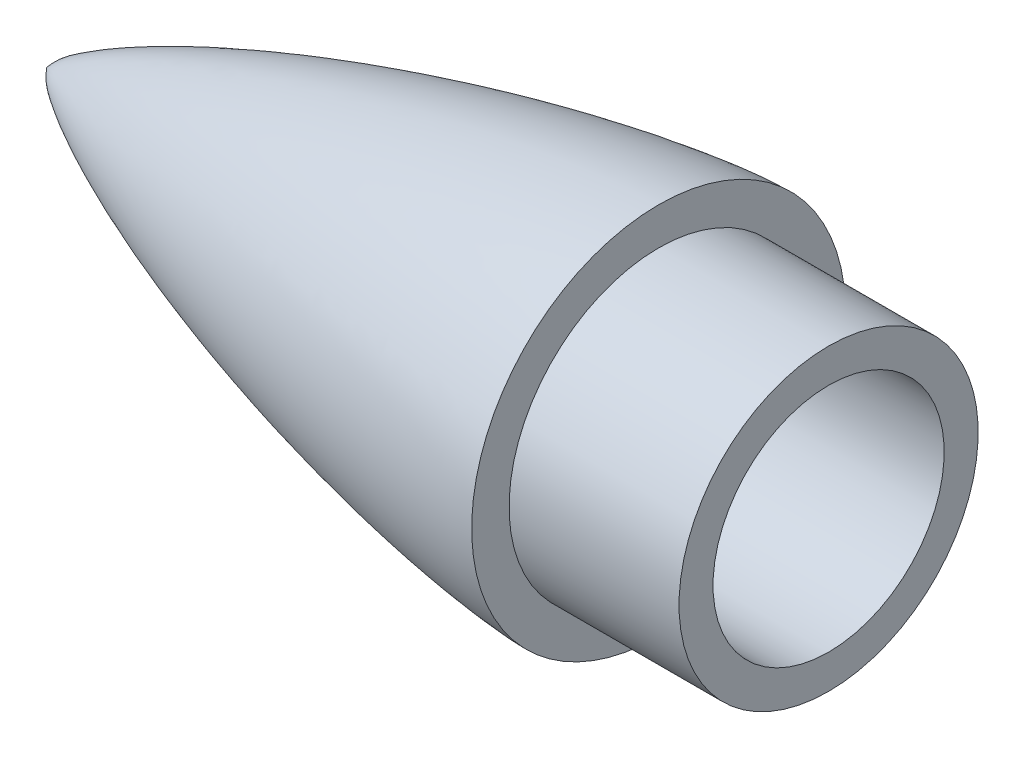
ISO-10303-21;
HEADER;
FILE_DESCRIPTION(('STEP AP214'),'2;1');
FILE_NAME('part.step','',(''),(''),'','','');
FILE_SCHEMA(('AUTOMOTIVE_DESIGN { 1 0 10303 214 1 1 1 1 }'));
ENDSEC;
DATA;
#1=APPLICATION_CONTEXT('core data for automotive mechanical design processes');
#2=APPLICATION_PROTOCOL_DEFINITION('international standard','automotive_design',2000,#1);
#3=PRODUCT_CONTEXT('',#1,'mechanical');
#4=PRODUCT('Part','Part','',(#3));
#5=PRODUCT_RELATED_PRODUCT_CATEGORY('part','',(#4));
#6=PRODUCT_DEFINITION_FORMATION('','',#4);
#7=PRODUCT_DEFINITION_CONTEXT('part definition',#1,'design');
#8=PRODUCT_DEFINITION('design','',#6,#7);
#9=PRODUCT_DEFINITION_SHAPE('','',#8);
#10=(LENGTH_UNIT() NAMED_UNIT(*) SI_UNIT(.MILLI.,.METRE.));
#11=(NAMED_UNIT(*) PLANE_ANGLE_UNIT() SI_UNIT($,.RADIAN.));
#12=(NAMED_UNIT(*) SI_UNIT($,.STERADIAN.) SOLID_ANGLE_UNIT());
#13=UNCERTAINTY_MEASURE_WITH_UNIT(LENGTH_MEASURE(1.E-05),#10,'distance_accuracy_value','');
#14=(GEOMETRIC_REPRESENTATION_CONTEXT(3) GLOBAL_UNCERTAINTY_ASSIGNED_CONTEXT((#13)) GLOBAL_UNIT_ASSIGNED_CONTEXT((#10,
#11,#12)) REPRESENTATION_CONTEXT('',''));
#15=CARTESIAN_POINT('',(0.,0.,0.));
#16=DIRECTION('',(0.,0.,1.));
#17=DIRECTION('',(1.,0.,0.));
#18=AXIS2_PLACEMENT_3D('',#15,#16,#17);
#19=CARTESIAN_POINT('',(114.3,34.925,0.));
#20=CARTESIAN_POINT('',(113.453026040436,34.89852959177,0.));
#21=CARTESIAN_POINT('',(111.757641310584,34.8455438707815,0.));
#22=CARTESIAN_POINT('',(109.218036433055,34.6560825758847,0.));
#23=CARTESIAN_POINT('',(106.678002759862,34.428418110229,0.));
#24=CARTESIAN_POINT('',(104.138052986633,34.1575275747471,0.));
#25=CARTESIAN_POINT('',(101.598067779405,33.8527294689841,0.));
#26=CARTESIAN_POINT('',(99.0580823691102,33.5167298182161,0.));
#27=CARTESIAN_POINT('',(96.5180888078215,33.1525019915084,0.));
#28=CARTESIAN_POINT('',(93.9780900912451,32.7620131870466,0.));
#29=CARTESIAN_POINT('',(91.4380859664442,32.3468716868891,0.));
#30=CARTESIAN_POINT('',(88.8980768121741,31.9083327980056,0.));
#31=CARTESIAN_POINT('',(86.3580626982301,31.4474100239113,0.));
#32=CARTESIAN_POINT('',(83.8180436366751,30.9649202638275,0.));
#33=CARTESIAN_POINT('',(81.2780195541834,30.4615231040718,0.));
#34=CARTESIAN_POINT('',(78.7379902798595,29.9377468408304,0.));
#35=CARTESIAN_POINT('',(76.1979555748968,29.3940076213082,0.));
#36=CARTESIAN_POINT('',(73.6579151254676,28.8306234064664,0.));
#37=CARTESIAN_POINT('',(71.1178684970022,28.2478242681468,0.));
#38=CARTESIAN_POINT('',(68.5778151694351,27.645759339323,0.));
#39=CARTESIAN_POINT('',(66.0377545151014,27.0245016660959,0.));
#40=CARTESIAN_POINT('',(63.4976857394855,26.3840511954619,0.));
#41=CARTESIAN_POINT('',(60.9576078887634,25.7243356932058,0.));
#42=CARTESIAN_POINT('',(58.4175198400356,25.045210112825,0.));
#43=CARTESIAN_POINT('',(55.877420165,24.3464547420503,0.));
#44=CARTESIAN_POINT('',(53.3373071600354,23.6277709852854,0.));
#45=CARTESIAN_POINT('',(50.797178738493,22.8887757133907,0.));
#46=CARTESIAN_POINT('',(48.2570322788206,22.1289935047364,0.));
#47=CARTESIAN_POINT('',(45.7168645219404,21.347845974575,0.));
#48=CARTESIAN_POINT('',(43.1766713776261,20.544638043952,0.));
#49=CARTESIAN_POINT('',(40.6364475668162,19.7185403812802,0.));
#50=CARTESIAN_POINT('',(38.0961862947327,18.8685660683806,0.));
#51=CARTESIAN_POINT('',(35.5558785716261,17.9935406292954,0.));
#52=CARTESIAN_POINT('',(33.015512376741,17.0920619453019,0.));
#53=CARTESIAN_POINT('',(30.4750712655684,16.1624469311258,0.));
#54=CARTESIAN_POINT('',(27.93453196355,15.2026586250983,0.));
#55=CARTESIAN_POINT('',(25.3938617489514,14.2102032490872,0.));
#56=CARTESIAN_POINT('',(22.8530083427663,13.1819877114141,0.));
#57=CARTESIAN_POINT('',(20.3119034128834,12.1140872078668,0.));
#58=CARTESIAN_POINT('',(17.77038501996,11.0014658377121,0.));
#59=CARTESIAN_POINT('',(15.2283628071559,9.8372126275123,0.));
#60=CARTESIAN_POINT('',(12.6849161692184,8.61239923408931,0.));
#61=CARTESIAN_POINT('',(10.1410296533681,7.31115795474611,0.));
#62=CARTESIAN_POINT('',(7.58716631723767,5.91841056380093,0.));
#63=CARTESIAN_POINT('',(5.04304112357842,4.36330597546705,0.));
#64=CARTESIAN_POINT('',(2.98872841582833,3.05354070409091,0.));
#65=CARTESIAN_POINT('',(1.94293634762843,2.08436441742979,0.));
#66=CARTESIAN_POINT('',(1.65979601685018,1.80359882787486,0.));
#67=B_SPLINE_CURVE_WITH_KNOTS('',3,(#19,#20,#21,#22,#23,#24,#25,#26,#27,#28,#29,#30,#31,#32,#33,
#34,#35,#36,#37,#38,#39,#40,#41,#42,#43,#44,#45,#46,#47,#48,#49,#50,#51,#52,#53,#54,#55,#56,#57,
#58,#59,#60,#61,#62,#63,#64,#65,#66),.UNSPECIFIED.,.F.,.F.,(4,1,1,1,1,1,1,1,1,1,1,1,1,1,1,1,1,1,
1,1,1,1,1,1,1,1,1,1,1,1,1,1,1,1,1,1,1,1,1,1,1,1,1,1,1,4),(0.,0.021013910984668,
0.0420634700696366,0.0631466363983293,0.0842627251779025,0.105411293048861,0.126592048715553,
0.147804821479612,0.169049544732574,0.190326246478947,0.211635043349371,0.232976137551378,
0.254349815492558,0.275756448230814,0.297196493241862,0.318670497825705,0.340179103747927,
0.361723053268565,0.38330319717968,0.404920504477723,0.426576074039688,0.448271149213233,
0.470007135336088,0.491785620589619,0.513608402144394,0.535477517644291,0.557395283839648,
0.579364345044261,0.60138773360311,0.62346894616178,0.645612042071877,0.667821770880441,
0.690103741370918,0.712464648721144,0.734912587680152,0.75745749415922,0.780111787306931,
0.802891335727732,0.825816976146352,0.848917028397362,0.872231752960537,0.895821992222375,
0.919788159413958,0.944320761074738,0.969889940978038,0.979792935445832),.UNSPECIFIED.);
#68=CARTESIAN_POINT('',(0.,0.,0.));
#69=DIRECTION('',(-1.,0.,0.));
#70=AXIS1_PLACEMENT('',#68,#69);
#71=SURFACE_OF_REVOLUTION('',#67,#70);
#72=OFFSET_SURFACE('',#71,-2.54,.F.);
#73=CARTESIAN_POINT('',(110.396147610997,1.27336097618394E-13,0.));
#74=DIRECTION('',(-1.,0.,0.));
#75=DIRECTION('',(0.,-1.,0.));
#76=AXIS2_PLACEMENT_3D('',#73,#74,#75);
#77=CIRCLE('',#76,32.1943831589782);
#78=CARTESIAN_POINT('',(110.396147610997,-32.1943831589781,0.));
#79=VERTEX_POINT('',#78);
#80=EDGE_CURVE('E49',#79,#79,#77,.F.);
#81=ORIENTED_EDGE('',*,*,#80,.T.);
#82=EDGE_LOOP('',(#81));
#83=FACE_BOUND('',#82,.T.);
#84=CARTESIAN_POINT('',(3.44826778573233,0.,0.));
#85=VERTEX_POINT('',#84);
#86=VERTEX_LOOP('',#85);
#87=FACE_BOUND('',#86,.T.);
#88=ADVANCED_FACE('F41',(#83,#87),#72,.F.);
#89=CARTESIAN_POINT('',(111.760000000004,34.9250000000001,0.));
#90=DIRECTION('',(-1.,0.,0.));
#91=DIRECTION('',(0.,-1.,0.));
#92=AXIS2_PLACEMENT_3D('',#89,#90,#91);
#93=PLANE('',#92);
#94=CARTESIAN_POINT('',(111.760000000004,1.28909228970366E-13,0.));
#95=DIRECTION('',(-1.,0.,0.));
#96=DIRECTION('',(0.,-1.,0.));
#97=AXIS2_PLACEMENT_3D('',#94,#95,#96);
#98=CIRCLE('',#97,30.9278557297145);
#99=CARTESIAN_POINT('',(111.760000000004,-30.9278557297143,0.));
#100=VERTEX_POINT('',#99);
#101=EDGE_CURVE('E112',#100,#100,#98,.T.);
#102=ORIENTED_EDGE('',*,*,#101,.T.);
#103=EDGE_LOOP('',(#102));
#104=FACE_BOUND('',#103,.T.);
#105=CARTESIAN_POINT('',(111.760000000004,1.28909228970366E-13,0.));
#106=DIRECTION('',(-1.,0.,0.));
#107=DIRECTION('',(0.,-1.,0.));
#108=AXIS2_PLACEMENT_3D('',#105,#106,#107);
#109=CIRCLE('',#108,22.86);
#110=CARTESIAN_POINT('',(111.760000000004,-22.8599999999999,0.));
#111=VERTEX_POINT('',#110);
#112=EDGE_CURVE('E69',#111,#111,#109,.F.);
#113=ORIENTED_EDGE('',*,*,#112,.T.);
#114=EDGE_LOOP('',(#113));
#115=FACE_BOUND('',#114,.T.);
#116=ADVANCED_FACE('F59',(#104,#115),#93,.T.);
#117=CARTESIAN_POINT('',(114.3,34.925,0.));
#118=CARTESIAN_POINT('',(113.453026040436,34.89852959177,0.));
#119=CARTESIAN_POINT('',(111.757641310584,34.8455438707815,0.));
#120=CARTESIAN_POINT('',(109.218036433055,34.6560825758847,0.));
#121=CARTESIAN_POINT('',(106.678002759862,34.428418110229,0.));
#122=CARTESIAN_POINT('',(104.138052986633,34.1575275747471,0.));
#123=CARTESIAN_POINT('',(101.598067779405,33.8527294689841,0.));
#124=CARTESIAN_POINT('',(99.0580823691102,33.5167298182161,0.));
#125=CARTESIAN_POINT('',(96.5180888078215,33.1525019915084,0.));
#126=CARTESIAN_POINT('',(93.9780900912451,32.7620131870466,0.));
#127=CARTESIAN_POINT('',(91.4380859664442,32.3468716868891,0.));
#128=CARTESIAN_POINT('',(88.8980768121741,31.9083327980056,0.));
#129=CARTESIAN_POINT('',(86.3580626982301,31.4474100239113,0.));
#130=CARTESIAN_POINT('',(83.8180436366751,30.9649202638275,0.));
#131=CARTESIAN_POINT('',(81.2780195541834,30.4615231040718,0.));
#132=CARTESIAN_POINT('',(78.7379902798595,29.9377468408304,0.));
#133=CARTESIAN_POINT('',(76.1979555748968,29.3940076213082,0.));
#134=CARTESIAN_POINT('',(73.6579151254676,28.8306234064664,0.));
#135=CARTESIAN_POINT('',(71.1178684970022,28.2478242681468,0.));
#136=CARTESIAN_POINT('',(68.5778151694351,27.645759339323,0.));
#137=CARTESIAN_POINT('',(66.0377545151014,27.0245016660959,0.));
#138=CARTESIAN_POINT('',(63.4976857394855,26.3840511954619,0.));
#139=CARTESIAN_POINT('',(60.9576078887634,25.7243356932058,0.));
#140=CARTESIAN_POINT('',(58.4175198400356,25.045210112825,0.));
#141=CARTESIAN_POINT('',(55.877420165,24.3464547420503,0.));
#142=CARTESIAN_POINT('',(53.3373071600354,23.6277709852854,0.));
#143=CARTESIAN_POINT('',(50.797178738493,22.8887757133907,0.));
#144=CARTESIAN_POINT('',(48.2570322788206,22.1289935047364,0.));
#145=CARTESIAN_POINT('',(45.7168645219404,21.347845974575,0.));
#146=CARTESIAN_POINT('',(43.1766713776261,20.544638043952,0.));
#147=CARTESIAN_POINT('',(40.6364475668162,19.7185403812802,0.));
#148=CARTESIAN_POINT('',(38.0961862947327,18.8685660683806,0.));
#149=CARTESIAN_POINT('',(35.5558785716261,17.9935406292954,0.));
#150=CARTESIAN_POINT('',(33.015512376741,17.0920619453019,0.));
#151=CARTESIAN_POINT('',(30.4750712655684,16.1624469311258,0.));
#152=CARTESIAN_POINT('',(27.93453196355,15.2026586250983,0.));
#153=CARTESIAN_POINT('',(25.3938617489514,14.2102032490872,0.));
#154=CARTESIAN_POINT('',(22.8530083427663,13.1819877114141,0.));
#155=CARTESIAN_POINT('',(20.3119034128834,12.1140872078668,0.));
#156=CARTESIAN_POINT('',(17.77038501996,11.0014658377121,0.));
#157=CARTESIAN_POINT('',(15.2283628071559,9.8372126275123,0.));
#158=CARTESIAN_POINT('',(12.6849161692184,8.61239923408931,0.));
#159=CARTESIAN_POINT('',(10.1410296533681,7.31115795474611,0.));
#160=CARTESIAN_POINT('',(7.58716631723767,5.91841056380093,0.));
#161=CARTESIAN_POINT('',(5.04304112357842,4.36330597546705,0.));
#162=CARTESIAN_POINT('',(2.29692299224165,2.61246729061051,0.));
#163=CARTESIAN_POINT('',(0.806166835726334,0.91691558499078,0.));
#164=CARTESIAN_POINT('',(0.,0.,0.));
#165=B_SPLINE_CURVE_WITH_KNOTS('',3,(#117,#118,#119,#120,#121,#122,#123,#124,#125,#126,#127,
#128,#129,#130,#131,#132,#133,#134,#135,#136,#137,#138,#139,#140,#141,#142,#143,#144,#145,#146,
#147,#148,#149,#150,#151,#152,#153,#154,#155,#156,#157,#158,#159,#160,#161,#162,#163,#164),
.UNSPECIFIED.,.F.,.F.,(4,1,1,1,1,1,1,1,1,1,1,1,1,1,1,1,1,1,1,1,1,1,1,1,1,1,1,1,1,1,1,1,1,1,1,1,
1,1,1,1,1,1,1,1,1,4),(0.,0.021013910984668,0.0420634700696366,0.0631466363983293,
0.0842627251779025,0.105411293048861,0.126592048715553,0.147804821479612,0.169049544732574,
0.190326246478947,0.211635043349371,0.232976137551378,0.254349815492558,0.275756448230814,
0.297196493241862,0.318670497825705,0.340179103747927,0.361723053268565,0.38330319717968,
0.404920504477723,0.426576074039688,0.448271149213233,0.470007135336088,0.491785620589619,
0.513608402144394,0.535477517644291,0.557395283839648,0.579364345044261,0.60138773360311,
0.62346894616178,0.645612042071877,0.667821770880441,0.690103741370918,0.712464648721144,
0.734912587680152,0.75745749415922,0.780111787306931,0.802891335727732,0.825816976146352,
0.848917028397362,0.872231752960537,0.895821992222375,0.919788159413958,0.944320761074738,
0.969889940978038,1.),.UNSPECIFIED.);
#166=CARTESIAN_POINT('',(0.,0.,0.));
#167=DIRECTION('',(-1.,0.,0.));
#168=AXIS1_PLACEMENT('',#166,#167);
#169=SURFACE_OF_REVOLUTION('',#165,#168);
#170=CARTESIAN_POINT('',(0.,0.,0.));
#171=VERTEX_POINT('',#170);
#172=VERTEX_LOOP('',#171);
#173=FACE_BOUND('',#172,.T.);
#174=CARTESIAN_POINT('',(114.300000000004,1.31838984174237E-13,0.));
#175=DIRECTION('',(-1.,0.,0.));
#176=DIRECTION('',(0.,-1.,0.));
#177=AXIS2_PLACEMENT_3D('',#174,#175,#176);
#178=CIRCLE('',#177,34.925);
#179=CARTESIAN_POINT('',(114.300000000004,-34.9249999999999,0.));
#180=VERTEX_POINT('',#179);
#181=EDGE_CURVE('E63',#180,#180,#178,.T.);
#182=ORIENTED_EDGE('',*,*,#181,.T.);
#183=EDGE_LOOP('',(#182));
#184=FACE_BOUND('',#183,.T.);
#185=ADVANCED_FACE('F55',(#173,#184),#169,.T.);
#186=CARTESIAN_POINT('',(114.300000000004,34.9250000000001,0.));
#187=DIRECTION('',(-1.,0.,0.));
#188=DIRECTION('',(0.,-1.,0.));
#189=AXIS2_PLACEMENT_3D('',#186,#187,#188);
#190=PLANE('',#189);
#191=CARTESIAN_POINT('',(114.300000000004,1.31838984174237E-13,0.));
#192=DIRECTION('',(-1.,0.,0.));
#193=DIRECTION('',(0.,-1.,0.));
#194=AXIS2_PLACEMENT_3D('',#191,#192,#193);
#195=CIRCLE('',#194,27.94);
#196=CARTESIAN_POINT('',(114.300000000004,-27.9399999999999,0.));
#197=VERTEX_POINT('',#196);
#198=EDGE_CURVE('E65',#197,#197,#195,.F.);
#199=ORIENTED_EDGE('',*,*,#198,.F.);
#200=EDGE_LOOP('',(#199));
#201=FACE_BOUND('',#200,.T.);
#202=ORIENTED_EDGE('',*,*,#181,.F.);
#203=EDGE_LOOP('',(#202));
#204=FACE_BOUND('',#203,.T.);
#205=ADVANCED_FACE('F58',(#201,#204),#190,.F.);
#206=CARTESIAN_POINT('',(146.050000000004,1.68460924222635E-13,0.));
#207=DIRECTION('',(1.,0.,0.));
#208=DIRECTION('',(0.,1.,0.));
#209=AXIS2_PLACEMENT_3D('',#206,#207,#208);
#210=PLANE('',#209);
#211=CARTESIAN_POINT('',(146.050000000004,1.68460924222635E-13,0.));
#212=DIRECTION('',(1.,0.,0.));
#213=DIRECTION('',(0.,1.,0.));
#214=AXIS2_PLACEMENT_3D('',#211,#212,#213);
#215=CIRCLE('',#214,27.94);
#216=CARTESIAN_POINT('',(146.050000000004,27.9400000000002,0.));
#217=VERTEX_POINT('',#216);
#218=EDGE_CURVE('E66',#217,#217,#215,.T.);
#219=ORIENTED_EDGE('',*,*,#218,.T.);
#220=EDGE_LOOP('',(#219));
#221=FACE_BOUND('',#220,.T.);
#222=CARTESIAN_POINT('',(146.050000000004,1.68460924222635E-13,0.));
#223=DIRECTION('',(1.,0.,0.));
#224=DIRECTION('',(0.,1.,0.));
#225=AXIS2_PLACEMENT_3D('',#222,#223,#224);
#226=CIRCLE('',#225,21.59);
#227=CARTESIAN_POINT('',(146.050000000004,21.5900000000002,0.));
#228=VERTEX_POINT('',#227);
#229=EDGE_CURVE('E72',#228,#228,#226,.T.);
#230=ORIENTED_EDGE('',*,*,#229,.F.);
#231=EDGE_LOOP('',(#230));
#232=FACE_BOUND('',#231,.T.);
#233=ADVANCED_FACE('F155',(#221,#232),#210,.T.);
#234=CARTESIAN_POINT('',(146.050000000004,1.68460924222635E-13,0.));
#235=DIRECTION('',(-1.,0.,0.));
#236=DIRECTION('',(0.,-1.,0.));
#237=AXIS2_PLACEMENT_3D('',#234,#235,#236);
#238=CYLINDRICAL_SURFACE('',#237,27.94);
#239=ORIENTED_EDGE('',*,*,#218,.F.);
#240=EDGE_LOOP('',(#239));
#241=FACE_BOUND('',#240,.T.);
#242=ORIENTED_EDGE('',*,*,#198,.T.);
#243=EDGE_LOOP('',(#242));
#244=FACE_BOUND('',#243,.T.);
#245=ADVANCED_FACE('F101',(#241,#244),#238,.T.);
#246=CARTESIAN_POINT('',(146.050000000004,1.68460924222635E-13,0.));
#247=DIRECTION('',(-1.,0.,0.));
#248=DIRECTION('',(0.,-1.,0.));
#249=AXIS2_PLACEMENT_3D('',#246,#247,#248);
#250=CYLINDRICAL_SURFACE('',#249,21.59);
#251=CARTESIAN_POINT('',(113.030000000004,1.30374106572301E-13,0.));
#252=DIRECTION('',(-1.,0.,0.));
#253=DIRECTION('',(0.,-1.,0.));
#254=AXIS2_PLACEMENT_3D('',#251,#252,#253);
#255=CIRCLE('',#254,21.59);
#256=CARTESIAN_POINT('',(113.030000000004,-21.5899999999999,0.));
#257=VERTEX_POINT('',#256);
#258=EDGE_CURVE('E11',#257,#257,#255,.T.);
#259=ORIENTED_EDGE('',*,*,#258,.T.);
#260=EDGE_LOOP('',(#259));
#261=FACE_BOUND('',#260,.T.);
#262=ORIENTED_EDGE('',*,*,#229,.T.);
#263=EDGE_LOOP('',(#262));
#264=FACE_BOUND('',#263,.T.);
#265=ADVANCED_FACE('F94',(#261,#264),#250,.F.);
#266=CARTESIAN_POINT('',(110.490000000004,1.2744435136843E-13,0.));
#267=DIRECTION('',(-1.,0.,0.));
#268=DIRECTION('',(0.,-1.,0.));
#269=AXIS2_PLACEMENT_3D('',#266,#267,#268);
#270=TOROIDAL_SURFACE('',#269,30.9278557297145,1.27);
#271=ORIENTED_EDGE('',*,*,#80,.F.);
#272=EDGE_LOOP('',(#271));
#273=FACE_BOUND('',#272,.T.);
#274=ORIENTED_EDGE('',*,*,#101,.F.);
#275=EDGE_LOOP('',(#274));
#276=FACE_BOUND('',#275,.T.);
#277=ADVANCED_FACE('F92',(#273,#276),#270,.F.);
#278=CARTESIAN_POINT('',(113.030000000004,1.30374106572301E-13,0.));
#279=DIRECTION('',(-1.,0.,0.));
#280=DIRECTION('',(0.,-1.,0.));
#281=AXIS2_PLACEMENT_3D('',#278,#279,#280);
#282=TOROIDAL_SURFACE('',#281,22.86,1.27);
#283=ORIENTED_EDGE('',*,*,#258,.F.);
#284=EDGE_LOOP('',(#283));
#285=FACE_BOUND('',#284,.T.);
#286=ORIENTED_EDGE('',*,*,#112,.F.);
#287=EDGE_LOOP('',(#286));
#288=FACE_BOUND('',#287,.T.);
#289=ADVANCED_FACE('F43',(#285,#288),#282,.T.);
#290=CLOSED_SHELL('',(#88,#116,#185,#205,#233,#245,#265,#277,#289));
#291=MANIFOLD_SOLID_BREP('B2',#290);
#292=ADVANCED_BREP_SHAPE_REPRESENTATION('',(#18,#291),#14);
#293=SHAPE_DEFINITION_REPRESENTATION(#9,#292);
ENDSEC;
END-ISO-10303-21;
